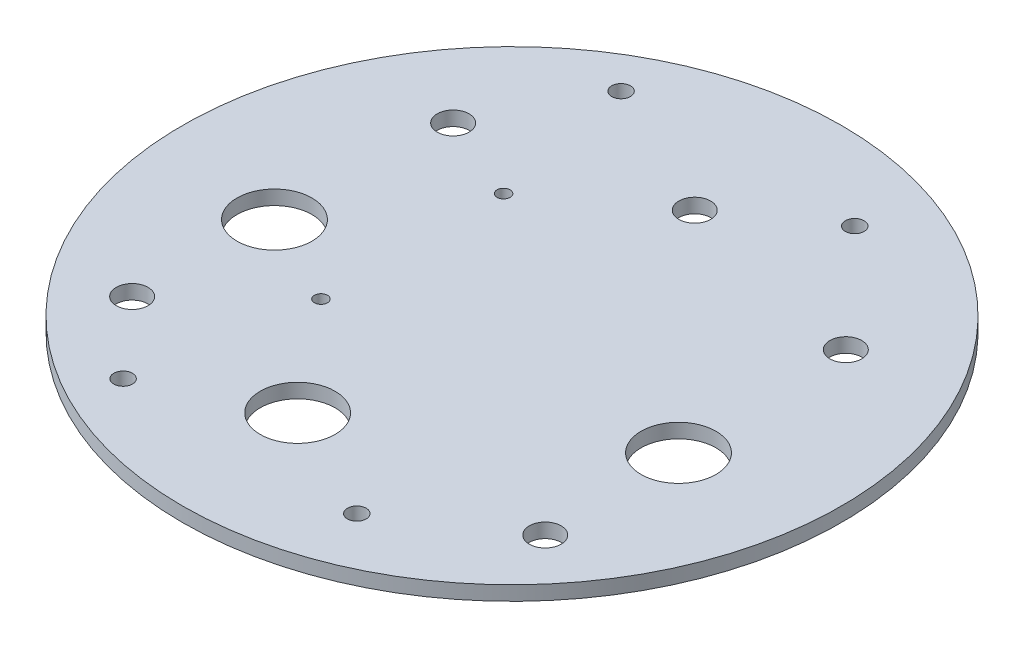
ISO-10303-21;
HEADER;
FILE_DESCRIPTION(('STEP AP214'),'2;1');
FILE_NAME('part.step','',(''),(''),'','','');
FILE_SCHEMA(('AUTOMOTIVE_DESIGN { 1 0 10303 214 1 1 1 1 }'));
ENDSEC;
DATA;
#1=APPLICATION_CONTEXT('core data for automotive mechanical design processes');
#2=APPLICATION_PROTOCOL_DEFINITION('international standard','automotive_design',2000,#1);
#3=PRODUCT_CONTEXT('',#1,'mechanical');
#4=PRODUCT('Part','Part','',(#3));
#5=PRODUCT_RELATED_PRODUCT_CATEGORY('part','',(#4));
#6=PRODUCT_DEFINITION_FORMATION('','',#4);
#7=PRODUCT_DEFINITION_CONTEXT('part definition',#1,'design');
#8=PRODUCT_DEFINITION('design','',#6,#7);
#9=PRODUCT_DEFINITION_SHAPE('','',#8);
#10=(LENGTH_UNIT() NAMED_UNIT(*) SI_UNIT(.MILLI.,.METRE.));
#11=(NAMED_UNIT(*) PLANE_ANGLE_UNIT() SI_UNIT($,.RADIAN.));
#12=(NAMED_UNIT(*) SI_UNIT($,.STERADIAN.) SOLID_ANGLE_UNIT());
#13=UNCERTAINTY_MEASURE_WITH_UNIT(LENGTH_MEASURE(1.E-05),#10,'distance_accuracy_value','');
#14=(GEOMETRIC_REPRESENTATION_CONTEXT(3) GLOBAL_UNCERTAINTY_ASSIGNED_CONTEXT((#13)) GLOBAL_UNIT_ASSIGNED_CONTEXT((#10,
#11,#12)) REPRESENTATION_CONTEXT('',''));
#15=CARTESIAN_POINT('',(0.,0.,0.));
#16=DIRECTION('',(0.,0.,1.));
#17=DIRECTION('',(1.,0.,0.));
#18=AXIS2_PLACEMENT_3D('',#15,#16,#17);
#19=CARTESIAN_POINT('',(0.,0.,0.));
#20=DIRECTION('',(0.,1.,0.));
#21=DIRECTION('',(0.,0.,1.));
#22=AXIS2_PLACEMENT_3D('',#19,#20,#21);
#23=PLANE('',#22);
#24=CARTESIAN_POINT('',(-42.8187437441748,0.,7.52531189358547));
#25=DIRECTION('',(0.,-1.,0.));
#26=DIRECTION('',(0.,0.,-1.));
#27=AXIS2_PLACEMENT_3D('',#24,#25,#26);
#28=CIRCLE('',#27,7.9375);
#29=CARTESIAN_POINT('',(-42.8187437441748,0.,-0.412188106414527));
#30=VERTEX_POINT('',#29);
#31=EDGE_CURVE('E130',#30,#30,#28,.T.);
#32=ORIENTED_EDGE('',*,*,#31,.F.);
#33=EDGE_LOOP('',(#32));
#34=FACE_BOUND('',#33,.T.);
#35=CARTESIAN_POINT('',(-4.88949999999996,0.,40.5453118935855));
#36=DIRECTION('',(0.,-1.,0.));
#37=DIRECTION('',(0.,0.,-1.));
#38=AXIS2_PLACEMENT_3D('',#35,#36,#37);
#39=CIRCLE('',#38,7.9375);
#40=CARTESIAN_POINT('',(-4.88949999999996,0.,32.6078118935855));
#41=VERTEX_POINT('',#40);
#42=EDGE_CURVE('E124',#41,#41,#39,.T.);
#43=ORIENTED_EDGE('',*,*,#42,.F.);
#44=EDGE_LOOP('',(#43));
#45=FACE_BOUND('',#44,.T.);
#46=CARTESIAN_POINT('',(42.8187437441745,0.,7.52531189358547));
#47=DIRECTION('',(0.,-1.,0.));
#48=DIRECTION('',(0.,0.,-1.));
#49=AXIS2_PLACEMENT_3D('',#46,#47,#48);
#50=CIRCLE('',#49,7.9375);
#51=CARTESIAN_POINT('',(42.8187437441745,0.,-0.412188106414527));
#52=VERTEX_POINT('',#51);
#53=EDGE_CURVE('E118',#52,#52,#50,.T.);
#54=ORIENTED_EDGE('',*,*,#53,.F.);
#55=EDGE_LOOP('',(#54));
#56=FACE_BOUND('',#55,.T.);
#57=CARTESIAN_POINT('',(-29.6545,0.,52.7685));
#58=DIRECTION('',(0.,-1.,0.));
#59=DIRECTION('',(0.,0.,-1.));
#60=AXIS2_PLACEMENT_3D('',#57,#58,#59);
#61=CIRCLE('',#60,1.984375);
#62=CARTESIAN_POINT('',(-29.6545,0.,50.784125));
#63=VERTEX_POINT('',#62);
#64=EDGE_CURVE('E112',#63,#63,#61,.T.);
#65=ORIENTED_EDGE('',*,*,#64,.F.);
#66=EDGE_LOOP('',(#65));
#67=FACE_BOUND('',#66,.T.);
#68=CARTESIAN_POINT('',(19.8755,0.,52.7685));
#69=DIRECTION('',(0.,-1.,0.));
#70=DIRECTION('',(0.,0.,-1.));
#71=AXIS2_PLACEMENT_3D('',#68,#69,#70);
#72=CIRCLE('',#71,1.984375);
#73=CARTESIAN_POINT('',(19.8755,0.,50.784125));
#74=VERTEX_POINT('',#73);
#75=EDGE_CURVE('E106',#74,#74,#72,.T.);
#76=ORIENTED_EDGE('',*,*,#75,.F.);
#77=EDGE_LOOP('',(#76));
#78=FACE_BOUND('',#77,.T.);
#79=CARTESIAN_POINT('',(19.8755,0.,-52.7685));
#80=DIRECTION('',(0.,-1.,0.));
#81=DIRECTION('',(0.,0.,-1.));
#82=AXIS2_PLACEMENT_3D('',#79,#80,#81);
#83=CIRCLE('',#82,1.984375);
#84=CARTESIAN_POINT('',(19.8755,0.,-54.752875));
#85=VERTEX_POINT('',#84);
#86=EDGE_CURVE('E100',#85,#85,#83,.T.);
#87=ORIENTED_EDGE('',*,*,#86,.F.);
#88=EDGE_LOOP('',(#87));
#89=FACE_BOUND('',#88,.T.);
#90=CARTESIAN_POINT('',(-29.6545,0.,-52.7685));
#91=DIRECTION('',(0.,-1.,0.));
#92=DIRECTION('',(0.,0.,-1.));
#93=AXIS2_PLACEMENT_3D('',#90,#91,#92);
#94=CIRCLE('',#93,1.984375);
#95=CARTESIAN_POINT('',(-29.6545,0.,-54.752875));
#96=VERTEX_POINT('',#95);
#97=EDGE_CURVE('E94',#96,#96,#94,.T.);
#98=ORIENTED_EDGE('',*,*,#97,.F.);
#99=EDGE_LOOP('',(#98));
#100=FACE_BOUND('',#99,.T.);
#101=CARTESIAN_POINT('',(-43.7794399242498,0.,36.7353118935855));
#102=DIRECTION('',(0.,-1.,0.));
#103=DIRECTION('',(0.,0.,-1.));
#104=AXIS2_PLACEMENT_3D('',#101,#102,#103);
#105=CIRCLE('',#104,3.373501);
#106=CARTESIAN_POINT('',(-43.7794399242498,0.,33.3618108935855));
#107=VERTEX_POINT('',#106);
#108=EDGE_CURVE('E88',#107,#107,#105,.T.);
#109=ORIENTED_EDGE('',*,*,#108,.F.);
#110=EDGE_LOOP('',(#109));
#111=FACE_BOUND('',#110,.T.);
#112=CARTESIAN_POINT('',(43.7794399242495,0.,36.7353118935858));
#113=DIRECTION('',(0.,-1.,0.));
#114=DIRECTION('',(0.,0.,-1.));
#115=AXIS2_PLACEMENT_3D('',#112,#113,#114);
#116=CIRCLE('',#115,3.373501);
#117=CARTESIAN_POINT('',(43.7794399242495,0.,33.3618108935858));
#118=VERTEX_POINT('',#117);
#119=EDGE_CURVE('E82',#118,#118,#116,.T.);
#120=ORIENTED_EDGE('',*,*,#119,.F.);
#121=EDGE_LOOP('',(#120));
#122=FACE_BOUND('',#121,.T.);
#123=CARTESIAN_POINT('',(41.6129238498807,0.,-29.1376829666332));
#124=DIRECTION('',(0.,-1.,0.));
#125=DIRECTION('',(0.,0.,-1.));
#126=AXIS2_PLACEMENT_3D('',#123,#124,#125);
#127=CIRCLE('',#126,3.373501);
#128=CARTESIAN_POINT('',(41.6129238498807,0.,-32.5111839666332));
#129=VERTEX_POINT('',#128);
#130=EDGE_CURVE('E74',#129,#129,#127,.T.);
#131=ORIENTED_EDGE('',*,*,#130,.F.);
#132=EDGE_LOOP('',(#131));
#133=FACE_BOUND('',#132,.T.);
#134=CARTESIAN_POINT('',(-41.6129238498809,0.,-29.1376829666329));
#135=DIRECTION('',(0.,-1.,0.));
#136=DIRECTION('',(0.,0.,-1.));
#137=AXIS2_PLACEMENT_3D('',#134,#135,#136);
#138=CIRCLE('',#137,3.373501);
#139=CARTESIAN_POINT('',(-41.6129238498809,0.,-32.5111839666329));
#140=VERTEX_POINT('',#139);
#141=EDGE_CURVE('E64',#140,#140,#138,.T.);
#142=ORIENTED_EDGE('',*,*,#141,.F.);
#143=EDGE_LOOP('',(#142));
#144=FACE_BOUND('',#143,.T.);
#145=CARTESIAN_POINT('',(0.,0.,-38.735));
#146=DIRECTION('',(0.,-1.,0.));
#147=DIRECTION('',(0.,0.,-1.));
#148=AXIS2_PLACEMENT_3D('',#145,#146,#147);
#149=CIRCLE('',#148,3.373501);
#150=CARTESIAN_POINT('',(0.,0.,-42.108501));
#151=VERTEX_POINT('',#150);
#152=EDGE_CURVE('E63',#151,#151,#149,.T.);
#153=ORIENTED_EDGE('',*,*,#152,.F.);
#154=EDGE_LOOP('',(#153));
#155=FACE_BOUND('',#154,.T.);
#156=CARTESIAN_POINT('',(0.,0.,0.));
#157=DIRECTION('',(0.,1.,0.));
#158=DIRECTION('',(0.,0.,1.));
#159=AXIS2_PLACEMENT_3D('',#156,#157,#158);
#160=CIRCLE('',#159,69.85);
#161=CARTESIAN_POINT('',(0.,0.,-69.85));
#162=VERTEX_POINT('',#161);
#163=EDGE_CURVE('E52',#162,#162,#160,.T.);
#164=ORIENTED_EDGE('',*,*,#163,.F.);
#165=EDGE_LOOP('',(#164));
#166=FACE_BOUND('',#165,.T.);
#167=CARTESIAN_POINT('',(-23.3045,0.,-21.5176829666329));
#168=DIRECTION('',(0.,-1.,0.));
#169=DIRECTION('',(0.,0.,-1.));
#170=AXIS2_PLACEMENT_3D('',#167,#168,#169);
#171=CIRCLE('',#170,1.389126);
#172=CARTESIAN_POINT('',(-23.3045,0.,-22.9068089666329));
#173=VERTEX_POINT('',#172);
#174=EDGE_CURVE('E136',#173,#173,#171,.T.);
#175=ORIENTED_EDGE('',*,*,#174,.F.);
#176=EDGE_LOOP('',(#175));
#177=FACE_BOUND('',#176,.T.);
#178=CARTESIAN_POINT('',(-23.3045,0.,17.1823170333671));
#179=DIRECTION('',(0.,-1.,0.));
#180=DIRECTION('',(0.,0.,-1.));
#181=AXIS2_PLACEMENT_3D('',#178,#179,#180);
#182=CIRCLE('',#181,1.389126);
#183=CARTESIAN_POINT('',(-23.3045,0.,15.7931910333671));
#184=VERTEX_POINT('',#183);
#185=EDGE_CURVE('E139',#184,#184,#182,.T.);
#186=ORIENTED_EDGE('',*,*,#185,.F.);
#187=EDGE_LOOP('',(#186));
#188=FACE_BOUND('',#187,.T.);
#189=ADVANCED_FACE('F44',(#34,#45,#56,#67,#78,#89,#100,#111,#122,#133,#144,#155,#166,#177,#188),
#23,.F.);
#190=CARTESIAN_POINT('',(0.,3.048,0.));
#191=DIRECTION('',(0.,-1.,0.));
#192=DIRECTION('',(0.,0.,-1.));
#193=AXIS2_PLACEMENT_3D('',#190,#191,#192);
#194=CYLINDRICAL_SURFACE('',#193,69.85);
#195=CARTESIAN_POINT('',(0.,3.048,0.));
#196=DIRECTION('',(0.,1.,0.));
#197=DIRECTION('',(0.,0.,1.));
#198=AXIS2_PLACEMENT_3D('',#195,#196,#197);
#199=CIRCLE('',#198,69.85);
#200=CARTESIAN_POINT('',(0.,3.048,-69.85));
#201=VERTEX_POINT('',#200);
#202=EDGE_CURVE('E12',#201,#201,#199,.T.);
#203=CARTESIAN_POINT('',(0.,3.048,-69.85));
#204=CARTESIAN_POINT('',(0.,3.01625,-69.85));
#205=CARTESIAN_POINT('',(0.,2.9845,-69.85));
#206=CARTESIAN_POINT('',(0.,2.921,-69.85));
#207=CARTESIAN_POINT('',(0.,2.88925,-69.85));
#208=CARTESIAN_POINT('',(0.,2.82575,-69.85));
#209=CARTESIAN_POINT('',(0.,2.794,-69.85));
#210=CARTESIAN_POINT('',(0.,2.7305,-69.85));
#211=CARTESIAN_POINT('',(0.,2.69875,-69.85));
#212=CARTESIAN_POINT('',(0.,2.63525,-69.85));
#213=CARTESIAN_POINT('',(0.,2.6035,-69.85));
#214=CARTESIAN_POINT('',(0.,2.54,-69.85));
#215=CARTESIAN_POINT('',(0.,2.50825,-69.85));
#216=CARTESIAN_POINT('',(0.,2.44475,-69.85));
#217=CARTESIAN_POINT('',(0.,2.413,-69.85));
#218=CARTESIAN_POINT('',(0.,2.3495,-69.85));
#219=CARTESIAN_POINT('',(0.,2.31775,-69.85));
#220=CARTESIAN_POINT('',(0.,2.25425,-69.85));
#221=CARTESIAN_POINT('',(0.,2.2225,-69.85));
#222=CARTESIAN_POINT('',(0.,2.159,-69.85));
#223=CARTESIAN_POINT('',(0.,2.12725,-69.85));
#224=CARTESIAN_POINT('',(0.,2.06375,-69.85));
#225=CARTESIAN_POINT('',(0.,2.032,-69.85));
#226=CARTESIAN_POINT('',(0.,1.9685,-69.85));
#227=CARTESIAN_POINT('',(0.,1.93675,-69.85));
#228=CARTESIAN_POINT('',(0.,1.87325,-69.85));
#229=CARTESIAN_POINT('',(0.,1.8415,-69.85));
#230=CARTESIAN_POINT('',(0.,1.778,-69.85));
#231=CARTESIAN_POINT('',(0.,1.74625,-69.85));
#232=CARTESIAN_POINT('',(0.,1.68275,-69.85));
#233=CARTESIAN_POINT('',(0.,1.651,-69.85));
#234=CARTESIAN_POINT('',(0.,1.5875,-69.85));
#235=CARTESIAN_POINT('',(0.,1.55575,-69.85));
#236=CARTESIAN_POINT('',(0.,1.49225,-69.85));
#237=CARTESIAN_POINT('',(0.,1.4605,-69.85));
#238=CARTESIAN_POINT('',(0.,1.397,-69.85));
#239=CARTESIAN_POINT('',(0.,1.36525,-69.85));
#240=CARTESIAN_POINT('',(0.,1.30175,-69.85));
#241=CARTESIAN_POINT('',(0.,1.27,-69.85));
#242=CARTESIAN_POINT('',(0.,1.2065,-69.85));
#243=CARTESIAN_POINT('',(0.,1.17475,-69.85));
#244=CARTESIAN_POINT('',(0.,1.11125,-69.85));
#245=CARTESIAN_POINT('',(0.,1.0795,-69.85));
#246=CARTESIAN_POINT('',(0.,1.016,-69.85));
#247=CARTESIAN_POINT('',(0.,0.98425,-69.85));
#248=CARTESIAN_POINT('',(0.,0.92075,-69.85));
#249=CARTESIAN_POINT('',(0.,0.889,-69.85));
#250=CARTESIAN_POINT('',(0.,0.8255,-69.85));
#251=CARTESIAN_POINT('',(0.,0.79375,-69.85));
#252=CARTESIAN_POINT('',(0.,0.73025,-69.85));
#253=CARTESIAN_POINT('',(0.,0.6985,-69.85));
#254=CARTESIAN_POINT('',(0.,0.635,-69.85));
#255=CARTESIAN_POINT('',(0.,0.60325,-69.85));
#256=CARTESIAN_POINT('',(0.,0.53975,-69.85));
#257=CARTESIAN_POINT('',(0.,0.508,-69.85));
#258=CARTESIAN_POINT('',(0.,0.4445,-69.85));
#259=CARTESIAN_POINT('',(0.,0.41275,-69.85));
#260=CARTESIAN_POINT('',(0.,0.34925,-69.85));
#261=CARTESIAN_POINT('',(0.,0.3175,-69.85));
#262=CARTESIAN_POINT('',(0.,0.254,-69.85));
#263=CARTESIAN_POINT('',(0.,0.22225,-69.85));
#264=CARTESIAN_POINT('',(0.,0.15875,-69.85));
#265=CARTESIAN_POINT('',(0.,0.127,-69.85));
#266=CARTESIAN_POINT('',(0.,0.0634999999999999,-69.85));
#267=CARTESIAN_POINT('',(0.,0.03175,-69.85));
#268=CARTESIAN_POINT('',(0.,0.,-69.85));
#269=B_SPLINE_CURVE_WITH_KNOTS('',3,(#203,#204,#205,#206,#207,#208,#209,#210,#211,#212,#213,
#214,#215,#216,#217,#218,#219,#220,#221,#222,#223,#224,#225,#226,#227,#228,#229,#230,#231,#232,
#233,#234,#235,#236,#237,#238,#239,#240,#241,#242,#243,#244,#245,#246,#247,#248,#249,#250,#251,
#252,#253,#254,#255,#256,#257,#258,#259,#260,#261,#262,#263,#264,#265,#266,#267,#268),
.UNSPECIFIED.,.F.,.F.,(4,2,2,2,2,2,2,2,2,2,2,2,2,2,2,2,2,2,2,2,2,2,2,2,2,2,2,2,2,2,2,2,4),(0.,
0.0952500000000003,0.1905,0.28575,0.381,0.47625,0.5715,0.66675,0.762,0.85725,0.9525,1.04775,
1.143,1.23825,1.3335,1.42875,1.524,1.61925,1.7145,1.80975,1.905,2.00025,2.0955,2.19075,2.286,
2.38125,2.4765,2.57175,2.667,2.76225,2.8575,2.95275,3.048),.UNSPECIFIED.);
#270=EDGE_CURVE('BSEAM46',#201,#162,#269,.T.);
#271=ORIENTED_EDGE('',*,*,#202,.F.);
#272=ORIENTED_EDGE('',*,*,#163,.T.);
#273=ORIENTED_EDGE('',*,*,#270,.T.);
#274=ORIENTED_EDGE('',*,*,#270,.F.);
#275=EDGE_LOOP('',(#271,#273,#272,#274));
#276=FACE_BOUND('',#275,.T.);
#277=ADVANCED_FACE('F46',(#276),#194,.T.);
#278=CARTESIAN_POINT('',(0.,3.048,0.));
#279=DIRECTION('',(0.,1.,0.));
#280=DIRECTION('',(0.,0.,1.));
#281=AXIS2_PLACEMENT_3D('',#278,#279,#280);
#282=PLANE('',#281);
#283=CARTESIAN_POINT('',(-23.3045,3.048,17.1823170333671));
#284=DIRECTION('',(0.,1.,0.));
#285=DIRECTION('',(0.,0.,1.));
#286=AXIS2_PLACEMENT_3D('',#283,#284,#285);
#287=CIRCLE('',#286,1.389126);
#288=CARTESIAN_POINT('',(-23.3045,3.048,18.5714430333671));
#289=VERTEX_POINT('',#288);
#290=EDGE_CURVE('E48',#289,#289,#287,.T.);
#291=ORIENTED_EDGE('',*,*,#290,.F.);
#292=EDGE_LOOP('',(#291));
#293=FACE_BOUND('',#292,.T.);
#294=CARTESIAN_POINT('',(-23.3045,3.048,-21.5176829666329));
#295=DIRECTION('',(0.,1.,0.));
#296=DIRECTION('',(0.,0.,1.));
#297=AXIS2_PLACEMENT_3D('',#294,#295,#296);
#298=CIRCLE('',#297,1.389126);
#299=CARTESIAN_POINT('',(-23.3045,3.048,-20.1285569666329));
#300=VERTEX_POINT('',#299);
#301=EDGE_CURVE('E133',#300,#300,#298,.T.);
#302=ORIENTED_EDGE('',*,*,#301,.F.);
#303=EDGE_LOOP('',(#302));
#304=FACE_BOUND('',#303,.T.);
#305=CARTESIAN_POINT('',(-42.8187437441748,3.048,7.52531189358547));
#306=DIRECTION('',(0.,1.,0.));
#307=DIRECTION('',(0.,0.,1.));
#308=AXIS2_PLACEMENT_3D('',#305,#306,#307);
#309=CIRCLE('',#308,7.9375);
#310=CARTESIAN_POINT('',(-42.8187437441748,3.048,15.4628118935855));
#311=VERTEX_POINT('',#310);
#312=EDGE_CURVE('E127',#311,#311,#309,.T.);
#313=ORIENTED_EDGE('',*,*,#312,.F.);
#314=EDGE_LOOP('',(#313));
#315=FACE_BOUND('',#314,.T.);
#316=CARTESIAN_POINT('',(-4.88949999999996,3.048,40.5453118935855));
#317=DIRECTION('',(0.,1.,0.));
#318=DIRECTION('',(0.,0.,1.));
#319=AXIS2_PLACEMENT_3D('',#316,#317,#318);
#320=CIRCLE('',#319,7.9375);
#321=CARTESIAN_POINT('',(-4.88949999999996,3.048,48.4828118935855));
#322=VERTEX_POINT('',#321);
#323=EDGE_CURVE('E121',#322,#322,#320,.T.);
#324=ORIENTED_EDGE('',*,*,#323,.F.);
#325=EDGE_LOOP('',(#324));
#326=FACE_BOUND('',#325,.T.);
#327=CARTESIAN_POINT('',(42.8187437441745,3.048,7.52531189358547));
#328=DIRECTION('',(0.,1.,0.));
#329=DIRECTION('',(0.,0.,1.));
#330=AXIS2_PLACEMENT_3D('',#327,#328,#329);
#331=CIRCLE('',#330,7.9375);
#332=CARTESIAN_POINT('',(42.8187437441745,3.048,15.4628118935855));
#333=VERTEX_POINT('',#332);
#334=EDGE_CURVE('E115',#333,#333,#331,.T.);
#335=ORIENTED_EDGE('',*,*,#334,.F.);
#336=EDGE_LOOP('',(#335));
#337=FACE_BOUND('',#336,.T.);
#338=CARTESIAN_POINT('',(-29.6545,3.048,52.7685));
#339=DIRECTION('',(0.,1.,0.));
#340=DIRECTION('',(0.,0.,1.));
#341=AXIS2_PLACEMENT_3D('',#338,#339,#340);
#342=CIRCLE('',#341,1.984375);
#343=CARTESIAN_POINT('',(-29.6545,3.048,54.752875));
#344=VERTEX_POINT('',#343);
#345=EDGE_CURVE('E109',#344,#344,#342,.T.);
#346=ORIENTED_EDGE('',*,*,#345,.F.);
#347=EDGE_LOOP('',(#346));
#348=FACE_BOUND('',#347,.T.);
#349=CARTESIAN_POINT('',(19.8755,3.048,52.7685));
#350=DIRECTION('',(0.,1.,0.));
#351=DIRECTION('',(0.,0.,1.));
#352=AXIS2_PLACEMENT_3D('',#349,#350,#351);
#353=CIRCLE('',#352,1.984375);
#354=CARTESIAN_POINT('',(19.8755,3.048,54.752875));
#355=VERTEX_POINT('',#354);
#356=EDGE_CURVE('E103',#355,#355,#353,.T.);
#357=ORIENTED_EDGE('',*,*,#356,.F.);
#358=EDGE_LOOP('',(#357));
#359=FACE_BOUND('',#358,.T.);
#360=CARTESIAN_POINT('',(19.8755,3.048,-52.7685));
#361=DIRECTION('',(0.,1.,0.));
#362=DIRECTION('',(0.,0.,1.));
#363=AXIS2_PLACEMENT_3D('',#360,#361,#362);
#364=CIRCLE('',#363,1.984375);
#365=CARTESIAN_POINT('',(19.8755,3.048,-50.784125));
#366=VERTEX_POINT('',#365);
#367=EDGE_CURVE('E97',#366,#366,#364,.T.);
#368=ORIENTED_EDGE('',*,*,#367,.F.);
#369=EDGE_LOOP('',(#368));
#370=FACE_BOUND('',#369,.T.);
#371=CARTESIAN_POINT('',(-29.6545,3.048,-52.7685));
#372=DIRECTION('',(0.,1.,0.));
#373=DIRECTION('',(0.,0.,1.));
#374=AXIS2_PLACEMENT_3D('',#371,#372,#373);
#375=CIRCLE('',#374,1.984375);
#376=CARTESIAN_POINT('',(-29.6545,3.048,-50.784125));
#377=VERTEX_POINT('',#376);
#378=EDGE_CURVE('E91',#377,#377,#375,.T.);
#379=ORIENTED_EDGE('',*,*,#378,.F.);
#380=EDGE_LOOP('',(#379));
#381=FACE_BOUND('',#380,.T.);
#382=CARTESIAN_POINT('',(-43.7794399242498,3.048,36.7353118935855));
#383=DIRECTION('',(0.,1.,0.));
#384=DIRECTION('',(0.,0.,1.));
#385=AXIS2_PLACEMENT_3D('',#382,#383,#384);
#386=CIRCLE('',#385,3.373501);
#387=CARTESIAN_POINT('',(-43.7794399242498,3.048,40.1088128935855));
#388=VERTEX_POINT('',#387);
#389=EDGE_CURVE('E85',#388,#388,#386,.T.);
#390=ORIENTED_EDGE('',*,*,#389,.F.);
#391=EDGE_LOOP('',(#390));
#392=FACE_BOUND('',#391,.T.);
#393=CARTESIAN_POINT('',(43.7794399242495,3.048,36.7353118935858));
#394=DIRECTION('',(0.,1.,0.));
#395=DIRECTION('',(0.,0.,1.));
#396=AXIS2_PLACEMENT_3D('',#393,#394,#395);
#397=CIRCLE('',#396,3.373501);
#398=CARTESIAN_POINT('',(43.7794399242495,3.048,40.1088128935858));
#399=VERTEX_POINT('',#398);
#400=EDGE_CURVE('E79',#399,#399,#397,.T.);
#401=ORIENTED_EDGE('',*,*,#400,.F.);
#402=EDGE_LOOP('',(#401));
#403=FACE_BOUND('',#402,.T.);
#404=CARTESIAN_POINT('',(41.6129238498807,3.048,-29.1376829666332));
#405=DIRECTION('',(0.,1.,0.));
#406=DIRECTION('',(0.,0.,1.));
#407=AXIS2_PLACEMENT_3D('',#404,#405,#406);
#408=CIRCLE('',#407,3.373501);
#409=CARTESIAN_POINT('',(41.6129238498807,3.048,-25.7641819666332));
#410=VERTEX_POINT('',#409);
#411=EDGE_CURVE('E69',#410,#410,#408,.T.);
#412=ORIENTED_EDGE('',*,*,#411,.F.);
#413=EDGE_LOOP('',(#412));
#414=FACE_BOUND('',#413,.T.);
#415=CARTESIAN_POINT('',(-41.6129238498809,3.048,-29.1376829666329));
#416=DIRECTION('',(0.,1.,0.));
#417=DIRECTION('',(0.,0.,1.));
#418=AXIS2_PLACEMENT_3D('',#415,#416,#417);
#419=CIRCLE('',#418,3.373501);
#420=CARTESIAN_POINT('',(-41.6129238498809,3.048,-25.7641819666329));
#421=VERTEX_POINT('',#420);
#422=EDGE_CURVE('E61',#421,#421,#419,.T.);
#423=ORIENTED_EDGE('',*,*,#422,.F.);
#424=EDGE_LOOP('',(#423));
#425=FACE_BOUND('',#424,.T.);
#426=CARTESIAN_POINT('',(0.,3.048,-38.735));
#427=DIRECTION('',(0.,1.,0.));
#428=DIRECTION('',(0.,0.,1.));
#429=AXIS2_PLACEMENT_3D('',#426,#427,#428);
#430=CIRCLE('',#429,3.373501);
#431=CARTESIAN_POINT('',(0.,3.048,-35.361499));
#432=VERTEX_POINT('',#431);
#433=EDGE_CURVE('E57',#432,#432,#430,.T.);
#434=ORIENTED_EDGE('',*,*,#433,.F.);
#435=EDGE_LOOP('',(#434));
#436=FACE_BOUND('',#435,.T.);
#437=ORIENTED_EDGE('',*,*,#202,.T.);
#438=EDGE_LOOP('',(#437));
#439=FACE_BOUND('',#438,.T.);
#440=ADVANCED_FACE('F148',(#293,#304,#315,#326,#337,#348,#359,#370,#381,#392,#403,#414,#425,
#436,#439),#282,.T.);
#441=CARTESIAN_POINT('',(0.,0.,-38.735));
#442=DIRECTION('',(0.,-1.,0.));
#443=DIRECTION('',(0.,0.,-1.));
#444=AXIS2_PLACEMENT_3D('',#441,#442,#443);
#445=CYLINDRICAL_SURFACE('',#444,3.373501);
#446=ORIENTED_EDGE('',*,*,#433,.T.);
#447=EDGE_LOOP('',(#446));
#448=FACE_BOUND('',#447,.T.);
#449=ORIENTED_EDGE('',*,*,#152,.T.);
#450=EDGE_LOOP('',(#449));
#451=FACE_BOUND('',#450,.T.);
#452=ADVANCED_FACE('F151',(#448,#451),#445,.F.);
#453=CARTESIAN_POINT('',(-41.6129238498809,0.,-29.1376829666329));
#454=DIRECTION('',(0.,-1.,0.));
#455=DIRECTION('',(0.,0.,-1.));
#456=AXIS2_PLACEMENT_3D('',#453,#454,#455);
#457=CYLINDRICAL_SURFACE('',#456,3.373501);
#458=ORIENTED_EDGE('',*,*,#422,.T.);
#459=EDGE_LOOP('',(#458));
#460=FACE_BOUND('',#459,.T.);
#461=ORIENTED_EDGE('',*,*,#141,.T.);
#462=EDGE_LOOP('',(#461));
#463=FACE_BOUND('',#462,.T.);
#464=ADVANCED_FACE('F181',(#460,#463),#457,.F.);
#465=CARTESIAN_POINT('',(41.6129238498807,0.,-29.1376829666332));
#466=DIRECTION('',(0.,-1.,0.));
#467=DIRECTION('',(0.,0.,-1.));
#468=AXIS2_PLACEMENT_3D('',#465,#466,#467);
#469=CYLINDRICAL_SURFACE('',#468,3.373501);
#470=ORIENTED_EDGE('',*,*,#411,.T.);
#471=EDGE_LOOP('',(#470));
#472=FACE_BOUND('',#471,.T.);
#473=ORIENTED_EDGE('',*,*,#130,.T.);
#474=EDGE_LOOP('',(#473));
#475=FACE_BOUND('',#474,.T.);
#476=ADVANCED_FACE('F237',(#472,#475),#469,.F.);
#477=CARTESIAN_POINT('',(43.7794399242495,0.,36.7353118935858));
#478=DIRECTION('',(0.,-1.,0.));
#479=DIRECTION('',(0.,0.,-1.));
#480=AXIS2_PLACEMENT_3D('',#477,#478,#479);
#481=CYLINDRICAL_SURFACE('',#480,3.373501);
#482=ORIENTED_EDGE('',*,*,#400,.T.);
#483=EDGE_LOOP('',(#482));
#484=FACE_BOUND('',#483,.T.);
#485=ORIENTED_EDGE('',*,*,#119,.T.);
#486=EDGE_LOOP('',(#485));
#487=FACE_BOUND('',#486,.T.);
#488=ADVANCED_FACE('F233',(#484,#487),#481,.F.);
#489=CARTESIAN_POINT('',(-43.7794399242498,0.,36.7353118935855));
#490=DIRECTION('',(0.,-1.,0.));
#491=DIRECTION('',(0.,0.,-1.));
#492=AXIS2_PLACEMENT_3D('',#489,#490,#491);
#493=CYLINDRICAL_SURFACE('',#492,3.373501);
#494=ORIENTED_EDGE('',*,*,#389,.T.);
#495=EDGE_LOOP('',(#494));
#496=FACE_BOUND('',#495,.T.);
#497=ORIENTED_EDGE('',*,*,#108,.T.);
#498=EDGE_LOOP('',(#497));
#499=FACE_BOUND('',#498,.T.);
#500=ADVANCED_FACE('F229',(#496,#499),#493,.F.);
#501=CARTESIAN_POINT('',(-29.6545,0.,-52.7685));
#502=DIRECTION('',(0.,-1.,0.));
#503=DIRECTION('',(0.,0.,-1.));
#504=AXIS2_PLACEMENT_3D('',#501,#502,#503);
#505=CYLINDRICAL_SURFACE('',#504,1.984375);
#506=ORIENTED_EDGE('',*,*,#378,.T.);
#507=EDGE_LOOP('',(#506));
#508=FACE_BOUND('',#507,.T.);
#509=ORIENTED_EDGE('',*,*,#97,.T.);
#510=EDGE_LOOP('',(#509));
#511=FACE_BOUND('',#510,.T.);
#512=ADVANCED_FACE('F225',(#508,#511),#505,.F.);
#513=CARTESIAN_POINT('',(19.8755,0.,-52.7685));
#514=DIRECTION('',(0.,-1.,0.));
#515=DIRECTION('',(0.,0.,-1.));
#516=AXIS2_PLACEMENT_3D('',#513,#514,#515);
#517=CYLINDRICAL_SURFACE('',#516,1.984375);
#518=ORIENTED_EDGE('',*,*,#367,.T.);
#519=EDGE_LOOP('',(#518));
#520=FACE_BOUND('',#519,.T.);
#521=ORIENTED_EDGE('',*,*,#86,.T.);
#522=EDGE_LOOP('',(#521));
#523=FACE_BOUND('',#522,.T.);
#524=ADVANCED_FACE('F221',(#520,#523),#517,.F.);
#525=CARTESIAN_POINT('',(19.8755,0.,52.7685));
#526=DIRECTION('',(0.,-1.,0.));
#527=DIRECTION('',(0.,0.,-1.));
#528=AXIS2_PLACEMENT_3D('',#525,#526,#527);
#529=CYLINDRICAL_SURFACE('',#528,1.984375);
#530=ORIENTED_EDGE('',*,*,#356,.T.);
#531=EDGE_LOOP('',(#530));
#532=FACE_BOUND('',#531,.T.);
#533=ORIENTED_EDGE('',*,*,#75,.T.);
#534=EDGE_LOOP('',(#533));
#535=FACE_BOUND('',#534,.T.);
#536=ADVANCED_FACE('F217',(#532,#535),#529,.F.);
#537=CARTESIAN_POINT('',(-29.6545,0.,52.7685));
#538=DIRECTION('',(0.,-1.,0.));
#539=DIRECTION('',(0.,0.,-1.));
#540=AXIS2_PLACEMENT_3D('',#537,#538,#539);
#541=CYLINDRICAL_SURFACE('',#540,1.984375);
#542=ORIENTED_EDGE('',*,*,#345,.T.);
#543=EDGE_LOOP('',(#542));
#544=FACE_BOUND('',#543,.T.);
#545=ORIENTED_EDGE('',*,*,#64,.T.);
#546=EDGE_LOOP('',(#545));
#547=FACE_BOUND('',#546,.T.);
#548=ADVANCED_FACE('F213',(#544,#547),#541,.F.);
#549=CARTESIAN_POINT('',(42.8187437441745,0.,7.52531189358547));
#550=DIRECTION('',(0.,-1.,0.));
#551=DIRECTION('',(0.,0.,-1.));
#552=AXIS2_PLACEMENT_3D('',#549,#550,#551);
#553=CYLINDRICAL_SURFACE('',#552,7.9375);
#554=ORIENTED_EDGE('',*,*,#334,.T.);
#555=EDGE_LOOP('',(#554));
#556=FACE_BOUND('',#555,.T.);
#557=ORIENTED_EDGE('',*,*,#53,.T.);
#558=EDGE_LOOP('',(#557));
#559=FACE_BOUND('',#558,.T.);
#560=ADVANCED_FACE('F209',(#556,#559),#553,.F.);
#561=CARTESIAN_POINT('',(-4.88949999999996,0.,40.5453118935855));
#562=DIRECTION('',(0.,-1.,0.));
#563=DIRECTION('',(0.,0.,-1.));
#564=AXIS2_PLACEMENT_3D('',#561,#562,#563);
#565=CYLINDRICAL_SURFACE('',#564,7.9375);
#566=ORIENTED_EDGE('',*,*,#323,.T.);
#567=EDGE_LOOP('',(#566));
#568=FACE_BOUND('',#567,.T.);
#569=ORIENTED_EDGE('',*,*,#42,.T.);
#570=EDGE_LOOP('',(#569));
#571=FACE_BOUND('',#570,.T.);
#572=ADVANCED_FACE('F203',(#568,#571),#565,.F.);
#573=CARTESIAN_POINT('',(-42.8187437441748,0.,7.52531189358547));
#574=DIRECTION('',(0.,-1.,0.));
#575=DIRECTION('',(0.,0.,-1.));
#576=AXIS2_PLACEMENT_3D('',#573,#574,#575);
#577=CYLINDRICAL_SURFACE('',#576,7.9375);
#578=ORIENTED_EDGE('',*,*,#312,.T.);
#579=EDGE_LOOP('',(#578));
#580=FACE_BOUND('',#579,.T.);
#581=ORIENTED_EDGE('',*,*,#31,.T.);
#582=EDGE_LOOP('',(#581));
#583=FACE_BOUND('',#582,.T.);
#584=ADVANCED_FACE('F195',(#580,#583),#577,.F.);
#585=CARTESIAN_POINT('',(-23.3045,0.,-21.5176829666329));
#586=DIRECTION('',(0.,-1.,0.));
#587=DIRECTION('',(0.,0.,-1.));
#588=AXIS2_PLACEMENT_3D('',#585,#586,#587);
#589=CYLINDRICAL_SURFACE('',#588,1.389126);
#590=ORIENTED_EDGE('',*,*,#301,.T.);
#591=EDGE_LOOP('',(#590));
#592=FACE_BOUND('',#591,.T.);
#593=ORIENTED_EDGE('',*,*,#174,.T.);
#594=EDGE_LOOP('',(#593));
#595=FACE_BOUND('',#594,.T.);
#596=ADVANCED_FACE('F193',(#592,#595),#589,.F.);
#597=CARTESIAN_POINT('',(-23.3045,0.,17.1823170333671));
#598=DIRECTION('',(0.,-1.,0.));
#599=DIRECTION('',(0.,0.,-1.));
#600=AXIS2_PLACEMENT_3D('',#597,#598,#599);
#601=CYLINDRICAL_SURFACE('',#600,1.389126);
#602=ORIENTED_EDGE('',*,*,#290,.T.);
#603=EDGE_LOOP('',(#602));
#604=FACE_BOUND('',#603,.T.);
#605=ORIENTED_EDGE('',*,*,#185,.T.);
#606=EDGE_LOOP('',(#605));
#607=FACE_BOUND('',#606,.T.);
#608=ADVANCED_FACE('F146',(#604,#607),#601,.F.);
#609=CLOSED_SHELL('',(#189,#277,#440,#452,#464,#476,#488,#500,#512,#524,#536,#548,#560,#572,
#584,#596,#608));
#610=MANIFOLD_SOLID_BREP('B2',#609);
#611=ADVANCED_BREP_SHAPE_REPRESENTATION('',(#18,#610),#14);
#612=SHAPE_DEFINITION_REPRESENTATION(#9,#611);
ENDSEC;
END-ISO-10303-21;
